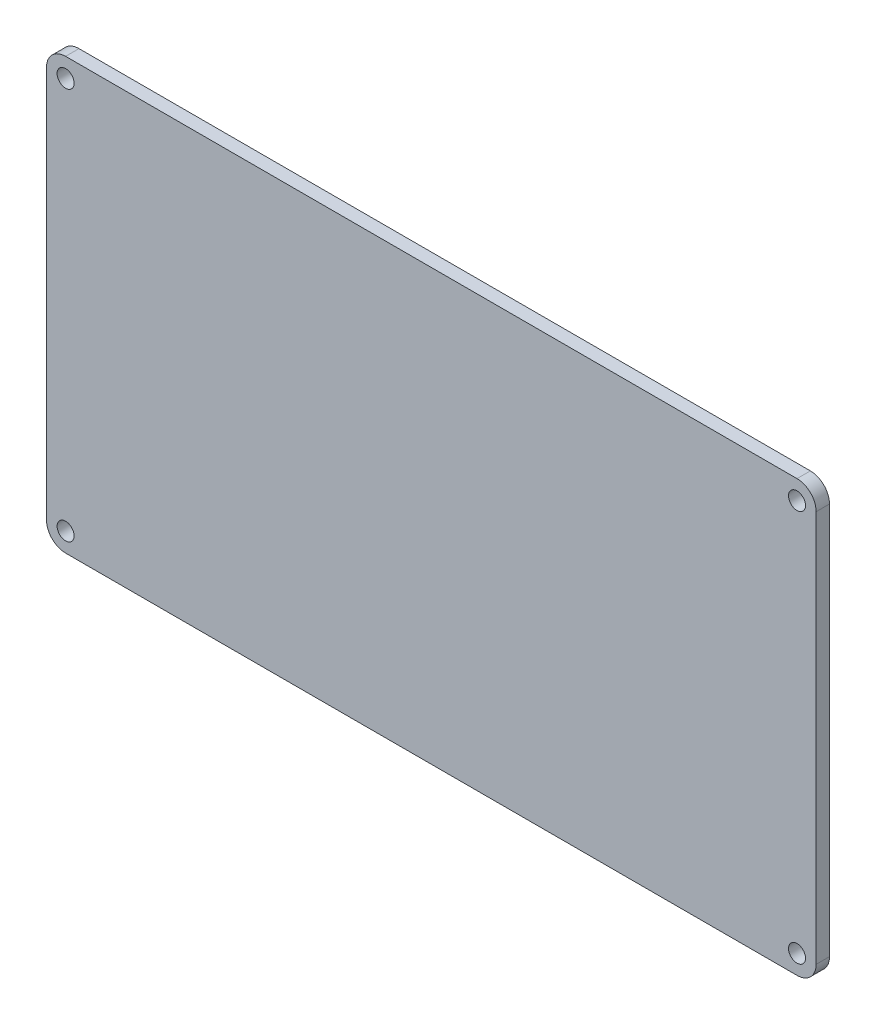
ISO-10303-21;
HEADER;
FILE_DESCRIPTION(('STEP AP214'),'2;1');
FILE_NAME('part.step','',(''),(''),'','','');
FILE_SCHEMA(('AUTOMOTIVE_DESIGN { 1 0 10303 214 1 1 1 1 }'));
ENDSEC;
DATA;
#1=APPLICATION_CONTEXT('core data for automotive mechanical design processes');
#2=APPLICATION_PROTOCOL_DEFINITION('international standard','automotive_design',2000,#1);
#3=PRODUCT_CONTEXT('',#1,'mechanical');
#4=PRODUCT('Part','Part','',(#3));
#5=PRODUCT_RELATED_PRODUCT_CATEGORY('part','',(#4));
#6=PRODUCT_DEFINITION_FORMATION('','',#4);
#7=PRODUCT_DEFINITION_CONTEXT('part definition',#1,'design');
#8=PRODUCT_DEFINITION('design','',#6,#7);
#9=PRODUCT_DEFINITION_SHAPE('','',#8);
#10=(LENGTH_UNIT() NAMED_UNIT(*) SI_UNIT(.MILLI.,.METRE.));
#11=(NAMED_UNIT(*) PLANE_ANGLE_UNIT() SI_UNIT($,.RADIAN.));
#12=(NAMED_UNIT(*) SI_UNIT($,.STERADIAN.) SOLID_ANGLE_UNIT());
#13=UNCERTAINTY_MEASURE_WITH_UNIT(LENGTH_MEASURE(1.E-05),#10,'distance_accuracy_value','');
#14=(GEOMETRIC_REPRESENTATION_CONTEXT(3) GLOBAL_UNCERTAINTY_ASSIGNED_CONTEXT((#13)) GLOBAL_UNIT_ASSIGNED_CONTEXT((#10,
#11,#12)) REPRESENTATION_CONTEXT('',''));
#15=CARTESIAN_POINT('',(0.,0.,0.));
#16=DIRECTION('',(0.,0.,1.));
#17=DIRECTION('',(1.,0.,0.));
#18=AXIS2_PLACEMENT_3D('',#15,#16,#17);
#19=CARTESIAN_POINT('',(0.,0.,-23.622));
#20=DIRECTION('',(0.,0.,1.));
#21=DIRECTION('',(1.,0.,0.));
#22=AXIS2_PLACEMENT_3D('',#19,#20,#21);
#23=PLANE('',#22);
#24=CARTESIAN_POINT('',(-37.4506060272133,36.1697534167786,-23.622));
#25=DIRECTION('',(0.,0.,1.));
#26=DIRECTION('',(1.,0.,0.));
#27=AXIS2_PLACEMENT_3D('',#24,#25,#26);
#28=CIRCLE('',#27,1.1303);
#29=CARTESIAN_POINT('',(-36.3203060272133,36.1697534167786,-23.622));
#30=VERTEX_POINT('',#29);
#31=EDGE_CURVE('E191',#30,#30,#28,.T.);
#32=ORIENTED_EDGE('',*,*,#31,.F.);
#33=EDGE_LOOP('',(#32));
#34=FACE_BOUND('',#33,.T.);
#35=CARTESIAN_POINT('',(59.7043939727867,36.1697534167786,-23.622));
#36=DIRECTION('',(0.,0.,1.));
#37=DIRECTION('',(1.,0.,0.));
#38=AXIS2_PLACEMENT_3D('',#35,#36,#37);
#39=CIRCLE('',#38,1.1303);
#40=CARTESIAN_POINT('',(60.8346939727867,36.1697534167786,-23.622));
#41=VERTEX_POINT('',#40);
#42=EDGE_CURVE('E185',#41,#41,#39,.T.);
#43=ORIENTED_EDGE('',*,*,#42,.F.);
#44=EDGE_LOOP('',(#43));
#45=FACE_BOUND('',#44,.T.);
#46=CARTESIAN_POINT('',(59.7043939727867,-15.9002465832214,-23.622));
#47=DIRECTION('',(0.,0.,1.));
#48=DIRECTION('',(1.,0.,0.));
#49=AXIS2_PLACEMENT_3D('',#46,#47,#48);
#50=CIRCLE('',#49,1.1303);
#51=CARTESIAN_POINT('',(60.8346939727867,-15.9002465832214,-23.622));
#52=VERTEX_POINT('',#51);
#53=EDGE_CURVE('E179',#52,#52,#50,.T.);
#54=ORIENTED_EDGE('',*,*,#53,.F.);
#55=EDGE_LOOP('',(#54));
#56=FACE_BOUND('',#55,.T.);
#57=CARTESIAN_POINT('',(-37.4506060272133,-15.9002465832214,-23.622));
#58=DIRECTION('',(0.,0.,1.));
#59=DIRECTION('',(1.,0.,0.));
#60=AXIS2_PLACEMENT_3D('',#57,#58,#59);
#61=CIRCLE('',#60,1.1303);
#62=CARTESIAN_POINT('',(-36.3203060272133,-15.9002465832214,-23.622));
#63=VERTEX_POINT('',#62);
#64=EDGE_CURVE('E173',#63,#63,#61,.T.);
#65=ORIENTED_EDGE('',*,*,#64,.F.);
#66=EDGE_LOOP('',(#65));
#67=FACE_BOUND('',#66,.T.);
#68=CARTESIAN_POINT('',(-37.4506060272133,-15.9002465832214,-23.622));
#69=DIRECTION('',(0.,0.,1.));
#70=DIRECTION('',(1.,0.,0.));
#71=AXIS2_PLACEMENT_3D('',#68,#69,#70);
#72=CIRCLE('',#71,2.54);
#73=CARTESIAN_POINT('',(-37.4506060272133,-18.4402465832214,-23.622));
#74=VERTEX_POINT('',#73);
#75=CARTESIAN_POINT('',(-39.9906060272133,-15.9002465832214,-23.622));
#76=VERTEX_POINT('',#75);
#77=EDGE_CURVE('E103',#74,#76,#72,.F.);
#78=ORIENTED_EDGE('',*,*,#77,.F.);
#79=DIRECTION('',(1.,0.,0.));
#80=VECTOR('',#79,1.);
#81=CARTESIAN_POINT('',(-39.9906060272133,-18.4402465832214,-23.622));
#82=LINE('',#81,#80);
#83=CARTESIAN_POINT('',(59.7043939727867,-18.4402465832214,-23.622));
#84=VERTEX_POINT('',#83);
#85=EDGE_CURVE('E104',#74,#84,#82,.T.);
#86=ORIENTED_EDGE('',*,*,#85,.T.);
#87=CARTESIAN_POINT('',(59.7043939727867,-15.9002465832214,-23.622));
#88=DIRECTION('',(0.,0.,1.));
#89=DIRECTION('',(1.,0.,0.));
#90=AXIS2_PLACEMENT_3D('',#87,#88,#89);
#91=CIRCLE('',#90,2.54);
#92=CARTESIAN_POINT('',(62.2443939727867,-15.9002465832214,-23.622));
#93=VERTEX_POINT('',#92);
#94=EDGE_CURVE('E111',#93,#84,#91,.F.);
#95=ORIENTED_EDGE('',*,*,#94,.F.);
#96=DIRECTION('',(0.,1.,0.));
#97=VECTOR('',#96,1.);
#98=CARTESIAN_POINT('',(62.2443939727867,26.5177534167786,-23.622));
#99=LINE('',#98,#97);
#100=CARTESIAN_POINT('',(62.2443939727867,36.1697534167786,-23.622));
#101=VERTEX_POINT('',#100);
#102=EDGE_CURVE('E116',#93,#101,#99,.T.);
#103=ORIENTED_EDGE('',*,*,#102,.T.);
#104=CARTESIAN_POINT('',(59.7043939727867,36.1697534167786,-23.622));
#105=DIRECTION('',(0.,0.,1.));
#106=DIRECTION('',(1.,0.,0.));
#107=AXIS2_PLACEMENT_3D('',#104,#105,#106);
#108=CIRCLE('',#107,2.54);
#109=CARTESIAN_POINT('',(59.7043939727867,38.7097534167786,-23.622));
#110=VERTEX_POINT('',#109);
#111=EDGE_CURVE('E37',#110,#101,#108,.F.);
#112=ORIENTED_EDGE('',*,*,#111,.F.);
#113=DIRECTION('',(-1.,0.,0.));
#114=VECTOR('',#113,1.);
#115=CARTESIAN_POINT('',(62.2443939727867,38.7097534167786,-23.622));
#116=LINE('',#115,#114);
#117=CARTESIAN_POINT('',(-37.4506060272133,38.7097534167786,-23.622));
#118=VERTEX_POINT('',#117);
#119=EDGE_CURVE('E140',#110,#118,#116,.T.);
#120=ORIENTED_EDGE('',*,*,#119,.T.);
#121=CARTESIAN_POINT('',(-37.4506060272133,36.1697534167786,-23.622));
#122=DIRECTION('',(0.,0.,1.));
#123=DIRECTION('',(1.,0.,0.));
#124=AXIS2_PLACEMENT_3D('',#121,#122,#123);
#125=CIRCLE('',#124,2.54);
#126=CARTESIAN_POINT('',(-39.9906060272133,36.1697534167786,-23.622));
#127=VERTEX_POINT('',#126);
#128=EDGE_CURVE('E147',#127,#118,#125,.F.);
#129=ORIENTED_EDGE('',*,*,#128,.F.);
#130=DIRECTION('',(0.,-1.,0.));
#131=VECTOR('',#130,1.);
#132=CARTESIAN_POINT('',(-39.9906060272133,-15.3922465832214,-23.622));
#133=LINE('',#132,#131);
#134=EDGE_CURVE('E107',#127,#76,#133,.T.);
#135=ORIENTED_EDGE('',*,*,#134,.T.);
#136=EDGE_LOOP('',(#78,#86,#95,#103,#112,#120,#129,#135));
#137=FACE_BOUND('',#136,.T.);
#138=ADVANCED_FACE('F33',(#34,#45,#56,#67,#137),#23,.T.);
#139=CARTESIAN_POINT('',(-39.9906060272133,-15.3922465832214,2.54));
#140=DIRECTION('',(1.,0.,0.));
#141=DIRECTION('',(0.,0.,-1.));
#142=AXIS2_PLACEMENT_3D('',#139,#140,#141);
#143=PLANE('',#142);
#144=ORIENTED_EDGE('',*,*,#134,.F.);
#145=DIRECTION('',(0.,0.,-1.));
#146=VECTOR('',#145,1.);
#147=CARTESIAN_POINT('',(-39.9906060272133,36.1697534167786,2.54));
#148=LINE('',#147,#146);
#149=CARTESIAN_POINT('',(-39.9906060272133,36.1697534167786,-25.4));
#150=VERTEX_POINT('',#149);
#151=EDGE_CURVE('E126',#127,#150,#148,.T.);
#152=ORIENTED_EDGE('',*,*,#151,.T.);
#153=DIRECTION('',(0.,-1.,0.));
#154=VECTOR('',#153,1.);
#155=CARTESIAN_POINT('',(-39.9906060272133,26.5177534167786,-25.4));
#156=LINE('',#155,#154);
#157=CARTESIAN_POINT('',(-39.9906060272133,-15.9002465832214,-25.4));
#158=VERTEX_POINT('',#157);
#159=EDGE_CURVE('E11',#150,#158,#156,.T.);
#160=ORIENTED_EDGE('',*,*,#159,.T.);
#161=DIRECTION('',(0.,0.,-1.));
#162=VECTOR('',#161,1.);
#163=CARTESIAN_POINT('',(-39.9906060272133,-15.9002465832214,2.54));
#164=LINE('',#163,#162);
#165=EDGE_CURVE('E128',#158,#76,#164,.F.);
#166=ORIENTED_EDGE('',*,*,#165,.T.);
#167=EDGE_LOOP('',(#144,#152,#160,#166));
#168=FACE_BOUND('',#167,.T.);
#169=ADVANCED_FACE('F199',(#168),#143,.F.);
#170=CARTESIAN_POINT('',(-39.9906060272133,-18.4402465832214,2.54));
#171=DIRECTION('',(0.,1.,0.));
#172=DIRECTION('',(-1.,0.,0.));
#173=AXIS2_PLACEMENT_3D('',#170,#171,#172);
#174=PLANE('',#173);
#175=ORIENTED_EDGE('',*,*,#85,.F.);
#176=DIRECTION('',(0.,0.,-1.));
#177=VECTOR('',#176,1.);
#178=CARTESIAN_POINT('',(-37.4506060272133,-18.4402465832214,2.54));
#179=LINE('',#178,#177);
#180=CARTESIAN_POINT('',(-37.4506060272133,-18.4402465832214,-25.4));
#181=VERTEX_POINT('',#180);
#182=EDGE_CURVE('E50',#74,#181,#179,.T.);
#183=ORIENTED_EDGE('',*,*,#182,.T.);
#184=DIRECTION('',(1.,0.,0.));
#185=VECTOR('',#184,1.);
#186=CARTESIAN_POINT('',(-39.9906060272133,-18.4402465832214,-25.4));
#187=LINE('',#186,#185);
#188=CARTESIAN_POINT('',(59.7043939727867,-18.4402465832214,-25.4));
#189=VERTEX_POINT('',#188);
#190=EDGE_CURVE('E42',#181,#189,#187,.T.);
#191=ORIENTED_EDGE('',*,*,#190,.T.);
#192=DIRECTION('',(0.,0.,-1.));
#193=VECTOR('',#192,1.);
#194=CARTESIAN_POINT('',(59.7043939727867,-18.4402465832214,2.54));
#195=LINE('',#194,#193);
#196=EDGE_CURVE('E115',#189,#84,#195,.F.);
#197=ORIENTED_EDGE('',*,*,#196,.T.);
#198=EDGE_LOOP('',(#175,#183,#191,#197));
#199=FACE_BOUND('',#198,.T.);
#200=ADVANCED_FACE('F113',(#199),#174,.F.);
#201=CARTESIAN_POINT('',(62.2443939727867,26.5177534167786,2.54));
#202=DIRECTION('',(-1.,0.,0.));
#203=DIRECTION('',(0.,-1.,0.));
#204=AXIS2_PLACEMENT_3D('',#201,#202,#203);
#205=PLANE('',#204);
#206=ORIENTED_EDGE('',*,*,#102,.F.);
#207=DIRECTION('',(0.,0.,-1.));
#208=VECTOR('',#207,1.);
#209=CARTESIAN_POINT('',(62.2443939727867,-15.9002465832214,2.54));
#210=LINE('',#209,#208);
#211=CARTESIAN_POINT('',(62.2443939727867,-15.9002465832214,-25.4));
#212=VERTEX_POINT('',#211);
#213=EDGE_CURVE('E133',#93,#212,#210,.T.);
#214=ORIENTED_EDGE('',*,*,#213,.T.);
#215=DIRECTION('',(0.,1.,0.));
#216=VECTOR('',#215,1.);
#217=CARTESIAN_POINT('',(62.2443939727867,-15.3922465832214,-25.4));
#218=LINE('',#217,#216);
#219=CARTESIAN_POINT('',(62.2443939727867,36.1697534167786,-25.4));
#220=VERTEX_POINT('',#219);
#221=EDGE_CURVE('E162',#212,#220,#218,.T.);
#222=ORIENTED_EDGE('',*,*,#221,.T.);
#223=DIRECTION('',(0.,0.,-1.));
#224=VECTOR('',#223,1.);
#225=CARTESIAN_POINT('',(62.2443939727867,36.1697534167786,2.54));
#226=LINE('',#225,#224);
#227=EDGE_CURVE('E130',#220,#101,#226,.F.);
#228=ORIENTED_EDGE('',*,*,#227,.T.);
#229=EDGE_LOOP('',(#206,#214,#222,#228));
#230=FACE_BOUND('',#229,.T.);
#231=ADVANCED_FACE('F161',(#230),#205,.F.);
#232=CARTESIAN_POINT('',(62.2443939727867,38.7097534167786,2.54));
#233=DIRECTION('',(0.,-1.,0.));
#234=DIRECTION('',(1.,0.,0.));
#235=AXIS2_PLACEMENT_3D('',#232,#233,#234);
#236=PLANE('',#235);
#237=ORIENTED_EDGE('',*,*,#119,.F.);
#238=DIRECTION('',(0.,0.,-1.));
#239=VECTOR('',#238,1.);
#240=CARTESIAN_POINT('',(59.7043939727867,38.7097534167786,2.54));
#241=LINE('',#240,#239);
#242=CARTESIAN_POINT('',(59.7043939727867,38.7097534167786,-25.4));
#243=VERTEX_POINT('',#242);
#244=EDGE_CURVE('E135',#110,#243,#241,.T.);
#245=ORIENTED_EDGE('',*,*,#244,.T.);
#246=DIRECTION('',(-1.,0.,0.));
#247=VECTOR('',#246,1.);
#248=CARTESIAN_POINT('',(62.2443939727867,38.7097534167786,-25.4));
#249=LINE('',#248,#247);
#250=CARTESIAN_POINT('',(-37.4506060272133,38.7097534167786,-25.4));
#251=VERTEX_POINT('',#250);
#252=EDGE_CURVE('E121',#243,#251,#249,.T.);
#253=ORIENTED_EDGE('',*,*,#252,.T.);
#254=DIRECTION('',(0.,0.,-1.));
#255=VECTOR('',#254,1.);
#256=CARTESIAN_POINT('',(-37.4506060272133,38.7097534167786,2.54));
#257=LINE('',#256,#255);
#258=EDGE_CURVE('E137',#251,#118,#257,.F.);
#259=ORIENTED_EDGE('',*,*,#258,.T.);
#260=EDGE_LOOP('',(#237,#245,#253,#259));
#261=FACE_BOUND('',#260,.T.);
#262=ADVANCED_FACE('F241',(#261),#236,.F.);
#263=CARTESIAN_POINT('',(-37.4506060272133,-15.9002465832214,2.54));
#264=DIRECTION('',(0.,0.,-1.));
#265=DIRECTION('',(-1.,0.,0.));
#266=AXIS2_PLACEMENT_3D('',#263,#264,#265);
#267=CYLINDRICAL_SURFACE('',#266,2.54);
#268=ORIENTED_EDGE('',*,*,#182,.F.);
#269=ORIENTED_EDGE('',*,*,#77,.T.);
#270=ORIENTED_EDGE('',*,*,#165,.F.);
#271=CARTESIAN_POINT('',(-37.4506060272133,-15.9002465832214,-25.4));
#272=DIRECTION('',(0.,0.,1.));
#273=DIRECTION('',(1.,0.,0.));
#274=AXIS2_PLACEMENT_3D('',#271,#272,#273);
#275=CIRCLE('',#274,2.54);
#276=EDGE_CURVE('E118',#181,#158,#275,.F.);
#277=ORIENTED_EDGE('',*,*,#276,.F.);
#278=EDGE_LOOP('',(#268,#269,#270,#277));
#279=FACE_BOUND('',#278,.T.);
#280=ADVANCED_FACE('F35',(#279),#267,.T.);
#281=CARTESIAN_POINT('',(59.7043939727867,-15.9002465832214,2.54));
#282=DIRECTION('',(0.,0.,-1.));
#283=DIRECTION('',(-1.,0.,0.));
#284=AXIS2_PLACEMENT_3D('',#281,#282,#283);
#285=CYLINDRICAL_SURFACE('',#284,2.54);
#286=ORIENTED_EDGE('',*,*,#213,.F.);
#287=ORIENTED_EDGE('',*,*,#94,.T.);
#288=ORIENTED_EDGE('',*,*,#196,.F.);
#289=CARTESIAN_POINT('',(59.7043939727867,-15.9002465832214,-25.4));
#290=DIRECTION('',(0.,0.,1.));
#291=DIRECTION('',(1.,0.,0.));
#292=AXIS2_PLACEMENT_3D('',#289,#290,#291);
#293=CIRCLE('',#292,2.54);
#294=EDGE_CURVE('E58',#212,#189,#293,.F.);
#295=ORIENTED_EDGE('',*,*,#294,.F.);
#296=EDGE_LOOP('',(#286,#287,#288,#295));
#297=FACE_BOUND('',#296,.T.);
#298=ADVANCED_FACE('F235',(#297),#285,.T.);
#299=CARTESIAN_POINT('',(-37.4506060272133,36.1697534167786,2.54));
#300=DIRECTION('',(0.,0.,-1.));
#301=DIRECTION('',(-1.,0.,0.));
#302=AXIS2_PLACEMENT_3D('',#299,#300,#301);
#303=CYLINDRICAL_SURFACE('',#302,2.54);
#304=ORIENTED_EDGE('',*,*,#151,.F.);
#305=ORIENTED_EDGE('',*,*,#128,.T.);
#306=ORIENTED_EDGE('',*,*,#258,.F.);
#307=CARTESIAN_POINT('',(-37.4506060272133,36.1697534167786,-25.4));
#308=DIRECTION('',(0.,0.,1.));
#309=DIRECTION('',(1.,0.,0.));
#310=AXIS2_PLACEMENT_3D('',#307,#308,#309);
#311=CIRCLE('',#310,2.54);
#312=EDGE_CURVE('E123',#150,#251,#311,.F.);
#313=ORIENTED_EDGE('',*,*,#312,.F.);
#314=EDGE_LOOP('',(#304,#305,#306,#313));
#315=FACE_BOUND('',#314,.T.);
#316=ADVANCED_FACE('F233',(#315),#303,.T.);
#317=CARTESIAN_POINT('',(59.7043939727867,36.1697534167786,2.54));
#318=DIRECTION('',(0.,0.,-1.));
#319=DIRECTION('',(-1.,0.,0.));
#320=AXIS2_PLACEMENT_3D('',#317,#318,#319);
#321=CYLINDRICAL_SURFACE('',#320,2.54);
#322=ORIENTED_EDGE('',*,*,#244,.F.);
#323=ORIENTED_EDGE('',*,*,#111,.T.);
#324=ORIENTED_EDGE('',*,*,#227,.F.);
#325=CARTESIAN_POINT('',(59.7043939727867,36.1697534167786,-25.4));
#326=DIRECTION('',(0.,0.,1.));
#327=DIRECTION('',(1.,0.,0.));
#328=AXIS2_PLACEMENT_3D('',#325,#326,#327);
#329=CIRCLE('',#328,2.54);
#330=EDGE_CURVE('E119',#243,#220,#329,.F.);
#331=ORIENTED_EDGE('',*,*,#330,.F.);
#332=EDGE_LOOP('',(#322,#323,#324,#331));
#333=FACE_BOUND('',#332,.T.);
#334=ADVANCED_FACE('F154',(#333),#321,.T.);
#335=CARTESIAN_POINT('',(0.,0.,-25.4));
#336=DIRECTION('',(0.,0.,1.));
#337=DIRECTION('',(1.,0.,0.));
#338=AXIS2_PLACEMENT_3D('',#335,#336,#337);
#339=PLANE('',#338);
#340=CARTESIAN_POINT('',(-37.4506060272133,36.1697534167786,-25.4));
#341=DIRECTION('',(0.,0.,1.));
#342=DIRECTION('',(1.,0.,0.));
#343=AXIS2_PLACEMENT_3D('',#340,#341,#342);
#344=CIRCLE('',#343,1.1303);
#345=CARTESIAN_POINT('',(-36.3203060272133,36.1697534167786,-25.4));
#346=VERTEX_POINT('',#345);
#347=EDGE_CURVE('E188',#346,#346,#344,.T.);
#348=ORIENTED_EDGE('',*,*,#347,.T.);
#349=EDGE_LOOP('',(#348));
#350=FACE_BOUND('',#349,.T.);
#351=CARTESIAN_POINT('',(59.7043939727867,36.1697534167786,-25.4));
#352=DIRECTION('',(0.,0.,1.));
#353=DIRECTION('',(1.,0.,0.));
#354=AXIS2_PLACEMENT_3D('',#351,#352,#353);
#355=CIRCLE('',#354,1.1303);
#356=CARTESIAN_POINT('',(60.8346939727867,36.1697534167786,-25.4));
#357=VERTEX_POINT('',#356);
#358=EDGE_CURVE('E182',#357,#357,#355,.T.);
#359=ORIENTED_EDGE('',*,*,#358,.T.);
#360=EDGE_LOOP('',(#359));
#361=FACE_BOUND('',#360,.T.);
#362=CARTESIAN_POINT('',(59.7043939727867,-15.9002465832214,-25.4));
#363=DIRECTION('',(0.,0.,1.));
#364=DIRECTION('',(1.,0.,0.));
#365=AXIS2_PLACEMENT_3D('',#362,#363,#364);
#366=CIRCLE('',#365,1.1303);
#367=CARTESIAN_POINT('',(60.8346939727867,-15.9002465832214,-25.4));
#368=VERTEX_POINT('',#367);
#369=EDGE_CURVE('E176',#368,#368,#366,.T.);
#370=ORIENTED_EDGE('',*,*,#369,.T.);
#371=EDGE_LOOP('',(#370));
#372=FACE_BOUND('',#371,.T.);
#373=CARTESIAN_POINT('',(-37.4506060272133,-15.9002465832214,-25.4));
#374=DIRECTION('',(0.,0.,1.));
#375=DIRECTION('',(1.,0.,0.));
#376=AXIS2_PLACEMENT_3D('',#373,#374,#375);
#377=CIRCLE('',#376,1.1303);
#378=CARTESIAN_POINT('',(-36.3203060272133,-15.9002465832214,-25.4));
#379=VERTEX_POINT('',#378);
#380=EDGE_CURVE('E143',#379,#379,#377,.T.);
#381=ORIENTED_EDGE('',*,*,#380,.T.);
#382=EDGE_LOOP('',(#381));
#383=FACE_BOUND('',#382,.T.);
#384=ORIENTED_EDGE('',*,*,#190,.F.);
#385=ORIENTED_EDGE('',*,*,#276,.T.);
#386=ORIENTED_EDGE('',*,*,#159,.F.);
#387=ORIENTED_EDGE('',*,*,#312,.T.);
#388=ORIENTED_EDGE('',*,*,#252,.F.);
#389=ORIENTED_EDGE('',*,*,#330,.T.);
#390=ORIENTED_EDGE('',*,*,#221,.F.);
#391=ORIENTED_EDGE('',*,*,#294,.T.);
#392=EDGE_LOOP('',(#384,#385,#386,#387,#388,#389,#390,#391));
#393=FACE_BOUND('',#392,.T.);
#394=ADVANCED_FACE('F202',(#350,#361,#372,#383,#393),#339,.F.);
#395=CARTESIAN_POINT('',(-37.4506060272133,-15.9002465832214,-23.622));
#396=DIRECTION('',(0.,0.,1.));
#397=DIRECTION('',(1.,0.,0.));
#398=AXIS2_PLACEMENT_3D('',#395,#396,#397);
#399=CYLINDRICAL_SURFACE('',#398,1.1303);
#400=ORIENTED_EDGE('',*,*,#380,.F.);
#401=EDGE_LOOP('',(#400));
#402=FACE_BOUND('',#401,.T.);
#403=ORIENTED_EDGE('',*,*,#64,.T.);
#404=EDGE_LOOP('',(#403));
#405=FACE_BOUND('',#404,.T.);
#406=ADVANCED_FACE('F201',(#402,#405),#399,.F.);
#407=CARTESIAN_POINT('',(59.7043939727867,-15.9002465832214,-23.622));
#408=DIRECTION('',(0.,0.,1.));
#409=DIRECTION('',(1.,0.,0.));
#410=AXIS2_PLACEMENT_3D('',#407,#408,#409);
#411=CYLINDRICAL_SURFACE('',#410,1.1303);
#412=ORIENTED_EDGE('',*,*,#369,.F.);
#413=EDGE_LOOP('',(#412));
#414=FACE_BOUND('',#413,.T.);
#415=ORIENTED_EDGE('',*,*,#53,.T.);
#416=EDGE_LOOP('',(#415));
#417=FACE_BOUND('',#416,.T.);
#418=ADVANCED_FACE('F210',(#414,#417),#411,.F.);
#419=CARTESIAN_POINT('',(59.7043939727867,36.1697534167786,-23.622));
#420=DIRECTION('',(0.,0.,1.));
#421=DIRECTION('',(1.,0.,0.));
#422=AXIS2_PLACEMENT_3D('',#419,#420,#421);
#423=CYLINDRICAL_SURFACE('',#422,1.1303);
#424=ORIENTED_EDGE('',*,*,#358,.F.);
#425=EDGE_LOOP('',(#424));
#426=FACE_BOUND('',#425,.T.);
#427=ORIENTED_EDGE('',*,*,#42,.T.);
#428=EDGE_LOOP('',(#427));
#429=FACE_BOUND('',#428,.T.);
#430=ADVANCED_FACE('F217',(#426,#429),#423,.F.);
#431=CARTESIAN_POINT('',(-37.4506060272133,36.1697534167786,-23.622));
#432=DIRECTION('',(0.,0.,1.));
#433=DIRECTION('',(1.,0.,0.));
#434=AXIS2_PLACEMENT_3D('',#431,#432,#433);
#435=CYLINDRICAL_SURFACE('',#434,1.1303);
#436=ORIENTED_EDGE('',*,*,#347,.F.);
#437=EDGE_LOOP('',(#436));
#438=FACE_BOUND('',#437,.T.);
#439=ORIENTED_EDGE('',*,*,#31,.T.);
#440=EDGE_LOOP('',(#439));
#441=FACE_BOUND('',#440,.T.);
#442=ADVANCED_FACE('F195',(#438,#441),#435,.F.);
#443=CLOSED_SHELL('',(#138,#169,#200,#231,#262,#280,#298,#316,#334,#394,#406,#418,#430,#442));
#444=MANIFOLD_SOLID_BREP('B2',#443);
#445=ADVANCED_BREP_SHAPE_REPRESENTATION('',(#18,#444),#14);
#446=SHAPE_DEFINITION_REPRESENTATION(#9,#445);
ENDSEC;
END-ISO-10303-21;
